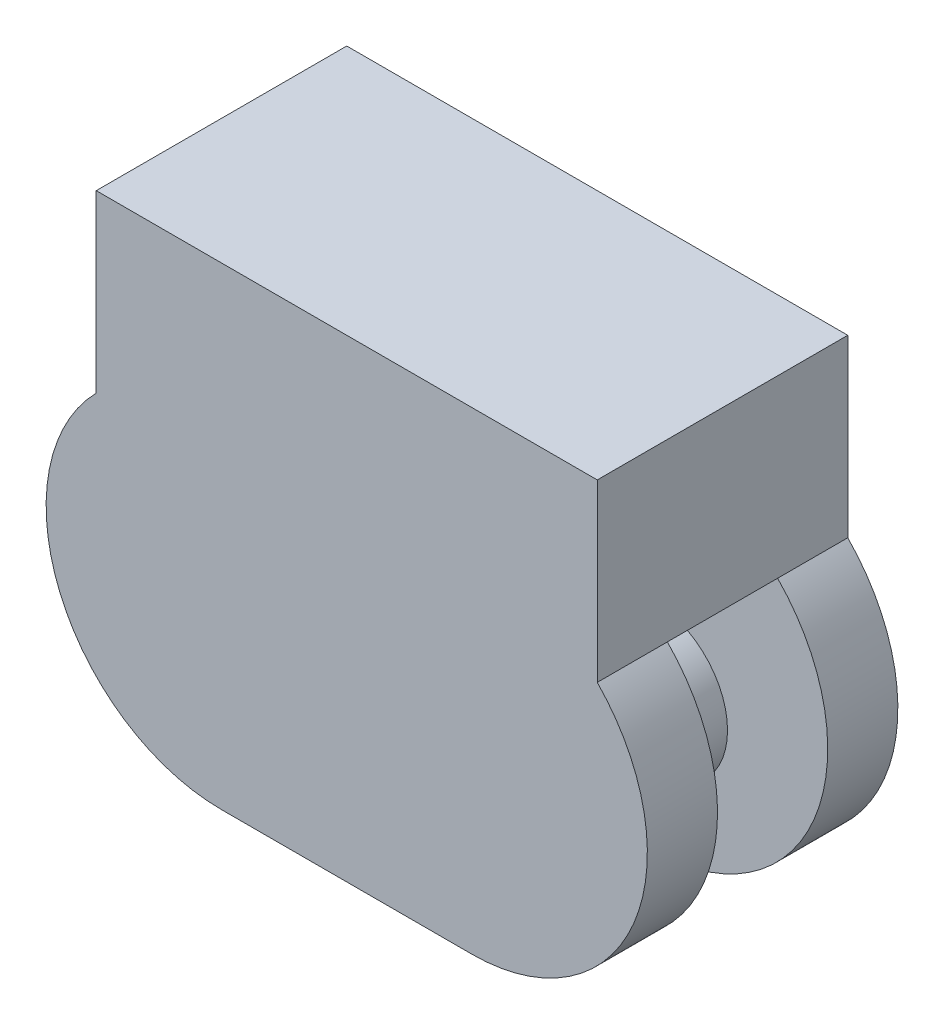
ISO-10303-21;
HEADER;
FILE_DESCRIPTION(('STEP AP214'),'2;1');
FILE_NAME('part.step','',(''),(''),'','','');
FILE_SCHEMA(('AUTOMOTIVE_DESIGN { 1 0 10303 214 1 1 1 1 }'));
ENDSEC;
DATA;
#1=APPLICATION_CONTEXT('core data for automotive mechanical design processes');
#2=APPLICATION_PROTOCOL_DEFINITION('international standard','automotive_design',2000,#1);
#3=PRODUCT_CONTEXT('',#1,'mechanical');
#4=PRODUCT('Part','Part','',(#3));
#5=PRODUCT_RELATED_PRODUCT_CATEGORY('part','',(#4));
#6=PRODUCT_DEFINITION_FORMATION('','',#4);
#7=PRODUCT_DEFINITION_CONTEXT('part definition',#1,'design');
#8=PRODUCT_DEFINITION('design','',#6,#7);
#9=PRODUCT_DEFINITION_SHAPE('','',#8);
#10=(LENGTH_UNIT() NAMED_UNIT(*) SI_UNIT(.MILLI.,.METRE.));
#11=(NAMED_UNIT(*) PLANE_ANGLE_UNIT() SI_UNIT($,.RADIAN.));
#12=(NAMED_UNIT(*) SI_UNIT($,.STERADIAN.) SOLID_ANGLE_UNIT());
#13=UNCERTAINTY_MEASURE_WITH_UNIT(LENGTH_MEASURE(1.E-05),#10,'distance_accuracy_value','');
#14=(GEOMETRIC_REPRESENTATION_CONTEXT(3) GLOBAL_UNCERTAINTY_ASSIGNED_CONTEXT((#13)) GLOBAL_UNIT_ASSIGNED_CONTEXT((#10,
#11,#12)) REPRESENTATION_CONTEXT('',''));
#15=CARTESIAN_POINT('',(0.,0.,0.));
#16=DIRECTION('',(0.,0.,1.));
#17=DIRECTION('',(1.,0.,0.));
#18=AXIS2_PLACEMENT_3D('',#15,#16,#17);
#19=CARTESIAN_POINT('',(-8.5,2.44948974278318,1.4));
#20=DIRECTION('',(0.,0.,-1.));
#21=DIRECTION('',(0.,1.,0.));
#22=AXIS2_PLACEMENT_3D('',#19,#20,#21);
#23=PLANE('',#22);
#24=DIRECTION('',(1.,0.,0.));
#25=VECTOR('',#24,1.);
#26=CARTESIAN_POINT('',(-8.5,2.44948974278318,1.4));
#27=LINE('',#26,#25);
#28=CARTESIAN_POINT('',(-7.5,2.44948974278318,1.4));
#29=VERTEX_POINT('',#28);
#30=CARTESIAN_POINT('',(2.5,2.44948974278318,1.4));
#31=VERTEX_POINT('',#30);
#32=EDGE_CURVE('E165',#29,#31,#27,.T.);
#33=ORIENTED_EDGE('',*,*,#32,.F.);
#34=CARTESIAN_POINT('',(-5.,0.,1.4));
#35=DIRECTION('',(0.,0.,-1.));
#36=DIRECTION('',(0.,1.,0.));
#37=AXIS2_PLACEMENT_3D('',#34,#35,#36);
#38=CIRCLE('',#37,3.5);
#39=CARTESIAN_POINT('',(-5.,-3.5,1.4));
#40=VERTEX_POINT('',#39);
#41=EDGE_CURVE('E174',#40,#29,#38,.T.);
#42=ORIENTED_EDGE('',*,*,#41,.F.);
#43=DIRECTION('',(-1.,0.,0.));
#44=VECTOR('',#43,1.);
#45=CARTESIAN_POINT('',(-5.,-3.5,1.4));
#46=LINE('',#45,#44);
#47=CARTESIAN_POINT('',(0.,-3.5,1.4));
#48=VERTEX_POINT('',#47);
#49=EDGE_CURVE('E236',#48,#40,#46,.T.);
#50=ORIENTED_EDGE('',*,*,#49,.F.);
#51=CARTESIAN_POINT('',(0.,0.,1.4));
#52=DIRECTION('',(0.,0.,-1.));
#53=DIRECTION('',(0.,1.,0.));
#54=AXIS2_PLACEMENT_3D('',#51,#52,#53);
#55=CIRCLE('',#54,3.5);
#56=EDGE_CURVE('E176',#31,#48,#55,.T.);
#57=ORIENTED_EDGE('',*,*,#56,.F.);
#58=EDGE_LOOP('',(#33,#42,#50,#57));
#59=FACE_BOUND('',#58,.T.);
#60=CARTESIAN_POINT('',(0.,-0.679025151906797,1.4));
#61=DIRECTION('',(0.,0.,-1.));
#62=DIRECTION('',(0.,1.,0.));
#63=AXIS2_PLACEMENT_3D('',#60,#61,#62);
#64=CIRCLE('',#63,1.5);
#65=CARTESIAN_POINT('',(0.,-2.1790251519068,1.4));
#66=VERTEX_POINT('',#65);
#67=CARTESIAN_POINT('',(0.,0.820974848093203,1.4));
#68=VERTEX_POINT('',#67);
#69=EDGE_CURVE('E136',#66,#68,#64,.F.);
#70=ORIENTED_EDGE('',*,*,#69,.F.);
#71=DIRECTION('',(1.,0.,0.));
#72=VECTOR('',#71,1.);
#73=CARTESIAN_POINT('',(-8.5,-2.1790251519068,1.4));
#74=LINE('',#73,#72);
#75=CARTESIAN_POINT('',(-5.,-2.1790251519068,1.4));
#76=VERTEX_POINT('',#75);
#77=EDGE_CURVE('E138',#76,#66,#74,.T.);
#78=ORIENTED_EDGE('',*,*,#77,.F.);
#79=CARTESIAN_POINT('',(-5.,-0.679025151906797,1.4));
#80=DIRECTION('',(0.,0.,-1.));
#81=DIRECTION('',(0.,1.,0.));
#82=AXIS2_PLACEMENT_3D('',#79,#80,#81);
#83=CIRCLE('',#82,1.5);
#84=CARTESIAN_POINT('',(-5.,0.820974848093203,1.4));
#85=VERTEX_POINT('',#84);
#86=EDGE_CURVE('E60',#85,#76,#83,.F.);
#87=ORIENTED_EDGE('',*,*,#86,.F.);
#88=DIRECTION('',(-1.,0.,0.));
#89=VECTOR('',#88,1.);
#90=CARTESIAN_POINT('',(-8.5,0.820974848093203,1.4));
#91=LINE('',#90,#89);
#92=EDGE_CURVE('E55',#68,#85,#91,.T.);
#93=ORIENTED_EDGE('',*,*,#92,.F.);
#94=EDGE_LOOP('',(#70,#78,#87,#93));
#95=FACE_BOUND('',#94,.T.);
#96=ADVANCED_FACE('F40',(#59,#95),#23,.F.);
#97=CARTESIAN_POINT('',(-8.5,2.44948974278318,3.6));
#98=DIRECTION('',(0.,0.,1.));
#99=DIRECTION('',(0.,-1.,0.));
#100=AXIS2_PLACEMENT_3D('',#97,#98,#99);
#101=PLANE('',#100);
#102=DIRECTION('',(1.,0.,0.));
#103=VECTOR('',#102,1.);
#104=CARTESIAN_POINT('',(-5.,-3.5,3.6));
#105=LINE('',#104,#103);
#106=CARTESIAN_POINT('',(-5.,-3.5,3.6));
#107=VERTEX_POINT('',#106);
#108=CARTESIAN_POINT('',(0.,-3.5,3.6));
#109=VERTEX_POINT('',#108);
#110=EDGE_CURVE('E233',#107,#109,#105,.T.);
#111=ORIENTED_EDGE('',*,*,#110,.F.);
#112=CARTESIAN_POINT('',(-5.,0.,3.6));
#113=DIRECTION('',(0.,0.,1.));
#114=DIRECTION('',(0.,-1.,0.));
#115=AXIS2_PLACEMENT_3D('',#112,#113,#114);
#116=CIRCLE('',#115,3.5);
#117=CARTESIAN_POINT('',(-7.5,2.44948974278318,3.6));
#118=VERTEX_POINT('',#117);
#119=EDGE_CURVE('E168',#118,#107,#116,.T.);
#120=ORIENTED_EDGE('',*,*,#119,.F.);
#121=DIRECTION('',(1.,0.,0.));
#122=VECTOR('',#121,1.);
#123=CARTESIAN_POINT('',(-8.5,2.44948974278318,3.6));
#124=LINE('',#123,#122);
#125=CARTESIAN_POINT('',(2.5,2.44948974278318,3.6));
#126=VERTEX_POINT('',#125);
#127=EDGE_CURVE('E143',#118,#126,#124,.T.);
#128=ORIENTED_EDGE('',*,*,#127,.T.);
#129=CARTESIAN_POINT('',(0.,0.,3.6));
#130=DIRECTION('',(0.,0.,1.));
#131=DIRECTION('',(0.,-1.,0.));
#132=AXIS2_PLACEMENT_3D('',#129,#130,#131);
#133=CIRCLE('',#132,3.5);
#134=EDGE_CURVE('E172',#109,#126,#133,.T.);
#135=ORIENTED_EDGE('',*,*,#134,.F.);
#136=EDGE_LOOP('',(#111,#120,#128,#135));
#137=FACE_BOUND('',#136,.T.);
#138=CARTESIAN_POINT('',(0.,-0.679025151906797,3.6));
#139=DIRECTION('',(0.,0.,1.));
#140=DIRECTION('',(0.,-1.,0.));
#141=AXIS2_PLACEMENT_3D('',#138,#139,#140);
#142=CIRCLE('',#141,1.5);
#143=CARTESIAN_POINT('',(0.,0.820974848093203,3.6));
#144=VERTEX_POINT('',#143);
#145=CARTESIAN_POINT('',(0.,-2.1790251519068,3.6));
#146=VERTEX_POINT('',#145);
#147=EDGE_CURVE('E11',#144,#146,#142,.F.);
#148=ORIENTED_EDGE('',*,*,#147,.F.);
#149=DIRECTION('',(1.,0.,0.));
#150=VECTOR('',#149,1.);
#151=CARTESIAN_POINT('',(-8.5,0.820974848093203,3.6));
#152=LINE('',#151,#150);
#153=CARTESIAN_POINT('',(-5.,0.820974848093203,3.6));
#154=VERTEX_POINT('',#153);
#155=EDGE_CURVE('E48',#154,#144,#152,.T.);
#156=ORIENTED_EDGE('',*,*,#155,.F.);
#157=CARTESIAN_POINT('',(-5.,-0.679025151906797,3.6));
#158=DIRECTION('',(0.,0.,1.));
#159=DIRECTION('',(0.,-1.,0.));
#160=AXIS2_PLACEMENT_3D('',#157,#158,#159);
#161=CIRCLE('',#160,1.5);
#162=CARTESIAN_POINT('',(-5.,-2.1790251519068,3.6));
#163=VERTEX_POINT('',#162);
#164=EDGE_CURVE('E241',#163,#154,#161,.F.);
#165=ORIENTED_EDGE('',*,*,#164,.F.);
#166=DIRECTION('',(-1.,0.,0.));
#167=VECTOR('',#166,1.);
#168=CARTESIAN_POINT('',(-8.5,-2.1790251519068,3.6));
#169=LINE('',#168,#167);
#170=EDGE_CURVE('E239',#146,#163,#169,.T.);
#171=ORIENTED_EDGE('',*,*,#170,.F.);
#172=EDGE_LOOP('',(#148,#156,#165,#171));
#173=FACE_BOUND('',#172,.T.);
#174=ADVANCED_FACE('F248',(#137,#173),#101,.F.);
#175=CARTESIAN_POINT('',(0.,0.,5.));
#176=DIRECTION('',(0.,0.,-1.));
#177=DIRECTION('',(-1.,0.,0.));
#178=AXIS2_PLACEMENT_3D('',#175,#176,#177);
#179=CYLINDRICAL_SURFACE('',#178,3.5);
#180=DIRECTION('',(0.,0.,-1.));
#181=VECTOR('',#180,1.);
#182=CARTESIAN_POINT('',(0.,-3.5,5.));
#183=LINE('',#182,#181);
#184=CARTESIAN_POINT('',(0.,-3.5,5.));
#185=VERTEX_POINT('',#184);
#186=EDGE_CURVE('E211',#185,#109,#183,.T.);
#187=ORIENTED_EDGE('',*,*,#186,.T.);
#188=ORIENTED_EDGE('',*,*,#134,.T.);
#189=DIRECTION('',(0.,0.,-1.));
#190=VECTOR('',#189,1.);
#191=CARTESIAN_POINT('',(2.5,2.44948974278318,5.));
#192=LINE('',#191,#190);
#193=CARTESIAN_POINT('',(2.5,2.44948974278318,5.));
#194=VERTEX_POINT('',#193);
#195=EDGE_CURVE('E230',#194,#126,#192,.T.);
#196=ORIENTED_EDGE('',*,*,#195,.F.);
#197=CARTESIAN_POINT('',(0.,0.,5.));
#198=DIRECTION('',(0.,0.,1.));
#199=DIRECTION('',(-1.,0.,0.));
#200=AXIS2_PLACEMENT_3D('',#197,#198,#199);
#201=CIRCLE('',#200,3.5);
#202=EDGE_CURVE('E182',#185,#194,#201,.T.);
#203=ORIENTED_EDGE('',*,*,#202,.F.);
#204=EDGE_LOOP('',(#187,#188,#196,#203));
#205=FACE_BOUND('',#204,.T.);
#206=ADVANCED_FACE('F265',(#205),#179,.T.);
#207=CARTESIAN_POINT('',(-5.,0.,5.));
#208=DIRECTION('',(0.,0.,-1.));
#209=DIRECTION('',(-1.,0.,0.));
#210=AXIS2_PLACEMENT_3D('',#207,#208,#209);
#211=CYLINDRICAL_SURFACE('',#210,3.5);
#212=DIRECTION('',(0.,0.,-1.));
#213=VECTOR('',#212,1.);
#214=CARTESIAN_POINT('',(-7.5,2.44948974278318,5.));
#215=LINE('',#214,#213);
#216=CARTESIAN_POINT('',(-7.5,2.44948974278318,5.));
#217=VERTEX_POINT('',#216);
#218=EDGE_CURVE('E219',#217,#118,#215,.T.);
#219=ORIENTED_EDGE('',*,*,#218,.T.);
#220=ORIENTED_EDGE('',*,*,#119,.T.);
#221=DIRECTION('',(0.,0.,-1.));
#222=VECTOR('',#221,1.);
#223=CARTESIAN_POINT('',(-5.,-3.5,5.));
#224=LINE('',#223,#222);
#225=CARTESIAN_POINT('',(-5.,-3.5,5.));
#226=VERTEX_POINT('',#225);
#227=EDGE_CURVE('E215',#226,#107,#224,.T.);
#228=ORIENTED_EDGE('',*,*,#227,.F.);
#229=CARTESIAN_POINT('',(-5.,0.,5.));
#230=DIRECTION('',(0.,0.,1.));
#231=DIRECTION('',(1.,0.,0.));
#232=AXIS2_PLACEMENT_3D('',#229,#230,#231);
#233=CIRCLE('',#232,3.5);
#234=EDGE_CURVE('E192',#217,#226,#233,.T.);
#235=ORIENTED_EDGE('',*,*,#234,.F.);
#236=EDGE_LOOP('',(#219,#220,#228,#235));
#237=FACE_BOUND('',#236,.T.);
#238=ADVANCED_FACE('F293',(#237),#211,.T.);
#239=CARTESIAN_POINT('',(-5.,-3.5,5.));
#240=DIRECTION('',(0.,1.,0.));
#241=DIRECTION('',(0.,0.,1.));
#242=AXIS2_PLACEMENT_3D('',#239,#240,#241);
#243=PLANE('',#242);
#244=CARTESIAN_POINT('',(0.,-3.5,0.));
#245=VERTEX_POINT('',#244);
#246=EDGE_CURVE('E196',#48,#245,#183,.T.);
#247=ORIENTED_EDGE('',*,*,#246,.F.);
#248=ORIENTED_EDGE('',*,*,#49,.T.);
#249=CARTESIAN_POINT('',(-5.,-3.5,0.));
#250=VERTEX_POINT('',#249);
#251=EDGE_CURVE('E214',#40,#250,#224,.T.);
#252=ORIENTED_EDGE('',*,*,#251,.T.);
#253=DIRECTION('',(1.,0.,0.));
#254=VECTOR('',#253,1.);
#255=CARTESIAN_POINT('',(-5.,-3.5,0.));
#256=LINE('',#255,#254);
#257=EDGE_CURVE('E186',#250,#245,#256,.T.);
#258=ORIENTED_EDGE('',*,*,#257,.T.);
#259=EDGE_LOOP('',(#247,#248,#252,#258));
#260=FACE_BOUND('',#259,.T.);
#261=ADVANCED_FACE('F288',(#260),#243,.F.);
#262=CARTESIAN_POINT('',(2.5,2.44948974278318,0.));
#263=VERTEX_POINT('',#262);
#264=EDGE_CURVE('E229',#31,#263,#192,.T.);
#265=ORIENTED_EDGE('',*,*,#264,.F.);
#266=ORIENTED_EDGE('',*,*,#56,.T.);
#267=ORIENTED_EDGE('',*,*,#246,.T.);
#268=CARTESIAN_POINT('',(0.,0.,0.));
#269=DIRECTION('',(0.,0.,1.));
#270=DIRECTION('',(-1.,0.,0.));
#271=AXIS2_PLACEMENT_3D('',#268,#269,#270);
#272=CIRCLE('',#271,3.5);
#273=EDGE_CURVE('E181',#245,#263,#272,.T.);
#274=ORIENTED_EDGE('',*,*,#273,.T.);
#275=EDGE_LOOP('',(#265,#266,#267,#274));
#276=FACE_BOUND('',#275,.T.);
#277=ADVANCED_FACE('F42',(#276),#179,.T.);
#278=CARTESIAN_POINT('',(2.5,5.94948974278318,5.));
#279=DIRECTION('',(-1.,0.,0.));
#280=DIRECTION('',(0.,-1.,0.));
#281=AXIS2_PLACEMENT_3D('',#278,#279,#280);
#282=PLANE('',#281);
#283=DIRECTION('',(0.,1.,0.));
#284=VECTOR('',#283,1.);
#285=CARTESIAN_POINT('',(2.5,5.94948974278318,0.));
#286=LINE('',#285,#284);
#287=CARTESIAN_POINT('',(2.5,5.94948974278318,0.));
#288=VERTEX_POINT('',#287);
#289=EDGE_CURVE('E199',#263,#288,#286,.T.);
#290=ORIENTED_EDGE('',*,*,#289,.T.);
#291=DIRECTION('',(0.,0.,-1.));
#292=VECTOR('',#291,1.);
#293=CARTESIAN_POINT('',(2.5,5.94948974278318,5.));
#294=LINE('',#293,#292);
#295=CARTESIAN_POINT('',(2.5,5.94948974278318,5.));
#296=VERTEX_POINT('',#295);
#297=EDGE_CURVE('E226',#296,#288,#294,.T.);
#298=ORIENTED_EDGE('',*,*,#297,.F.);
#299=DIRECTION('',(0.,1.,0.));
#300=VECTOR('',#299,1.);
#301=CARTESIAN_POINT('',(2.5,5.94948974278318,5.));
#302=LINE('',#301,#300);
#303=EDGE_CURVE('E185',#194,#296,#302,.T.);
#304=ORIENTED_EDGE('',*,*,#303,.F.);
#305=ORIENTED_EDGE('',*,*,#195,.T.);
#306=DIRECTION('',(0.,0.,-1.));
#307=VECTOR('',#306,1.);
#308=CARTESIAN_POINT('',(2.5,2.44948974278318,5.));
#309=LINE('',#308,#307);
#310=EDGE_CURVE('E178',#126,#31,#309,.T.);
#311=ORIENTED_EDGE('',*,*,#310,.T.);
#312=ORIENTED_EDGE('',*,*,#264,.T.);
#313=EDGE_LOOP('',(#290,#298,#304,#305,#311,#312));
#314=FACE_BOUND('',#313,.T.);
#315=ADVANCED_FACE('F299',(#314),#282,.F.);
#316=CARTESIAN_POINT('',(-7.5,5.94948974278318,5.));
#317=DIRECTION('',(0.,-1.,0.));
#318=DIRECTION('',(0.,0.,-1.));
#319=AXIS2_PLACEMENT_3D('',#316,#317,#318);
#320=PLANE('',#319);
#321=DIRECTION('',(-1.,0.,0.));
#322=VECTOR('',#321,1.);
#323=CARTESIAN_POINT('',(-7.5,5.94948974278318,0.));
#324=LINE('',#323,#322);
#325=CARTESIAN_POINT('',(-7.5,5.94948974278318,0.));
#326=VERTEX_POINT('',#325);
#327=EDGE_CURVE('E201',#288,#326,#324,.T.);
#328=ORIENTED_EDGE('',*,*,#327,.T.);
#329=DIRECTION('',(0.,0.,-1.));
#330=VECTOR('',#329,1.);
#331=CARTESIAN_POINT('',(-7.5,5.94948974278318,5.));
#332=LINE('',#331,#330);
#333=CARTESIAN_POINT('',(-7.5,5.94948974278318,5.));
#334=VERTEX_POINT('',#333);
#335=EDGE_CURVE('E222',#334,#326,#332,.T.);
#336=ORIENTED_EDGE('',*,*,#335,.F.);
#337=DIRECTION('',(-1.,0.,0.));
#338=VECTOR('',#337,1.);
#339=CARTESIAN_POINT('',(-7.5,5.94948974278318,5.));
#340=LINE('',#339,#338);
#341=EDGE_CURVE('E188',#296,#334,#340,.T.);
#342=ORIENTED_EDGE('',*,*,#341,.F.);
#343=ORIENTED_EDGE('',*,*,#297,.T.);
#344=EDGE_LOOP('',(#328,#336,#342,#343));
#345=FACE_BOUND('',#344,.T.);
#346=ADVANCED_FACE('F296',(#345),#320,.F.);
#347=CARTESIAN_POINT('',(-7.5,5.94948974278318,5.));
#348=DIRECTION('',(1.,0.,0.));
#349=DIRECTION('',(0.,1.,0.));
#350=AXIS2_PLACEMENT_3D('',#347,#348,#349);
#351=PLANE('',#350);
#352=DIRECTION('',(0.,-1.,0.));
#353=VECTOR('',#352,1.);
#354=CARTESIAN_POINT('',(-7.5,5.94948974278318,0.));
#355=LINE('',#354,#353);
#356=CARTESIAN_POINT('',(-7.5,2.44948974278318,0.));
#357=VERTEX_POINT('',#356);
#358=EDGE_CURVE('E203',#326,#357,#355,.T.);
#359=ORIENTED_EDGE('',*,*,#358,.T.);
#360=EDGE_CURVE('E218',#29,#357,#215,.T.);
#361=ORIENTED_EDGE('',*,*,#360,.F.);
#362=EDGE_CURVE('E223',#118,#29,#215,.T.);
#363=ORIENTED_EDGE('',*,*,#362,.F.);
#364=ORIENTED_EDGE('',*,*,#218,.F.);
#365=DIRECTION('',(0.,-1.,0.));
#366=VECTOR('',#365,1.);
#367=CARTESIAN_POINT('',(-7.5,5.94948974278318,5.));
#368=LINE('',#367,#366);
#369=EDGE_CURVE('E190',#334,#217,#368,.T.);
#370=ORIENTED_EDGE('',*,*,#369,.F.);
#371=ORIENTED_EDGE('',*,*,#335,.T.);
#372=EDGE_LOOP('',(#359,#361,#363,#364,#370,#371));
#373=FACE_BOUND('',#372,.T.);
#374=ADVANCED_FACE('F291',(#373),#351,.F.);
#375=ORIENTED_EDGE('',*,*,#251,.F.);
#376=ORIENTED_EDGE('',*,*,#41,.T.);
#377=ORIENTED_EDGE('',*,*,#360,.T.);
#378=CARTESIAN_POINT('',(-5.,0.,0.));
#379=DIRECTION('',(0.,0.,1.));
#380=DIRECTION('',(1.,0.,0.));
#381=AXIS2_PLACEMENT_3D('',#378,#379,#380);
#382=CIRCLE('',#381,3.5);
#383=EDGE_CURVE('E206',#357,#250,#382,.T.);
#384=ORIENTED_EDGE('',*,*,#383,.T.);
#385=EDGE_LOOP('',(#375,#376,#377,#384));
#386=FACE_BOUND('',#385,.T.);
#387=ADVANCED_FACE('F286',(#386),#211,.T.);
#388=ORIENTED_EDGE('',*,*,#227,.T.);
#389=ORIENTED_EDGE('',*,*,#110,.T.);
#390=ORIENTED_EDGE('',*,*,#186,.F.);
#391=DIRECTION('',(1.,0.,0.));
#392=VECTOR('',#391,1.);
#393=CARTESIAN_POINT('',(-5.,-3.5,5.));
#394=LINE('',#393,#392);
#395=EDGE_CURVE('E194',#226,#185,#394,.T.);
#396=ORIENTED_EDGE('',*,*,#395,.F.);
#397=EDGE_LOOP('',(#388,#389,#390,#396));
#398=FACE_BOUND('',#397,.T.);
#399=ADVANCED_FACE('F279',(#398),#243,.F.);
#400=CARTESIAN_POINT('',(0.,0.,5.));
#401=DIRECTION('',(0.,0.,-1.));
#402=DIRECTION('',(-1.,0.,0.));
#403=AXIS2_PLACEMENT_3D('',#400,#401,#402);
#404=PLANE('',#403);
#405=ORIENTED_EDGE('',*,*,#202,.T.);
#406=ORIENTED_EDGE('',*,*,#303,.T.);
#407=ORIENTED_EDGE('',*,*,#341,.T.);
#408=ORIENTED_EDGE('',*,*,#369,.T.);
#409=ORIENTED_EDGE('',*,*,#234,.T.);
#410=ORIENTED_EDGE('',*,*,#395,.T.);
#411=EDGE_LOOP('',(#405,#406,#407,#408,#409,#410));
#412=FACE_BOUND('',#411,.T.);
#413=ADVANCED_FACE('F276',(#412),#404,.F.);
#414=CARTESIAN_POINT('',(0.,0.,0.));
#415=DIRECTION('',(0.,0.,-1.));
#416=DIRECTION('',(-1.,0.,0.));
#417=AXIS2_PLACEMENT_3D('',#414,#415,#416);
#418=PLANE('',#417);
#419=ORIENTED_EDGE('',*,*,#273,.F.);
#420=ORIENTED_EDGE('',*,*,#257,.F.);
#421=ORIENTED_EDGE('',*,*,#383,.F.);
#422=ORIENTED_EDGE('',*,*,#358,.F.);
#423=ORIENTED_EDGE('',*,*,#327,.F.);
#424=ORIENTED_EDGE('',*,*,#289,.F.);
#425=EDGE_LOOP('',(#419,#420,#421,#422,#423,#424));
#426=FACE_BOUND('',#425,.T.);
#427=ADVANCED_FACE('F274',(#426),#418,.T.);
#428=CARTESIAN_POINT('',(-8.5,2.44948974278318,1.4));
#429=DIRECTION('',(0.,1.,0.));
#430=DIRECTION('',(0.,0.,1.));
#431=AXIS2_PLACEMENT_3D('',#428,#429,#430);
#432=PLANE('',#431);
#433=ORIENTED_EDGE('',*,*,#127,.F.);
#434=ORIENTED_EDGE('',*,*,#362,.T.);
#435=ORIENTED_EDGE('',*,*,#32,.T.);
#436=ORIENTED_EDGE('',*,*,#310,.F.);
#437=EDGE_LOOP('',(#433,#434,#435,#436));
#438=FACE_BOUND('',#437,.T.);
#439=ADVANCED_FACE('F271',(#438),#432,.F.);
#440=CARTESIAN_POINT('',(0.,-0.679025151906797,5.));
#441=DIRECTION('',(0.,0.,-1.));
#442=DIRECTION('',(-1.,0.,0.));
#443=AXIS2_PLACEMENT_3D('',#440,#441,#442);
#444=CYLINDRICAL_SURFACE('',#443,1.5);
#445=DIRECTION('',(0.,0.,-1.));
#446=VECTOR('',#445,1.);
#447=CARTESIAN_POINT('',(0.,-2.1790251519068,5.));
#448=LINE('',#447,#446);
#449=EDGE_CURVE('E150',#146,#66,#448,.T.);
#450=ORIENTED_EDGE('',*,*,#449,.T.);
#451=ORIENTED_EDGE('',*,*,#69,.T.);
#452=DIRECTION('',(0.,0.,-1.));
#453=VECTOR('',#452,1.);
#454=CARTESIAN_POINT('',(0.,0.820974848093203,5.));
#455=LINE('',#454,#453);
#456=EDGE_CURVE('E153',#144,#68,#455,.T.);
#457=ORIENTED_EDGE('',*,*,#456,.F.);
#458=ORIENTED_EDGE('',*,*,#147,.T.);
#459=EDGE_LOOP('',(#450,#451,#457,#458));
#460=FACE_BOUND('',#459,.T.);
#461=ADVANCED_FACE('F155',(#460),#444,.T.);
#462=CARTESIAN_POINT('',(0.,0.820974848093203,5.));
#463=DIRECTION('',(0.,-1.,0.));
#464=DIRECTION('',(0.,0.,-1.));
#465=AXIS2_PLACEMENT_3D('',#462,#463,#464);
#466=PLANE('',#465);
#467=ORIENTED_EDGE('',*,*,#456,.T.);
#468=ORIENTED_EDGE('',*,*,#92,.T.);
#469=DIRECTION('',(0.,0.,-1.));
#470=VECTOR('',#469,1.);
#471=CARTESIAN_POINT('',(-5.,0.820974848093203,5.));
#472=LINE('',#471,#470);
#473=EDGE_CURVE('E157',#154,#85,#472,.T.);
#474=ORIENTED_EDGE('',*,*,#473,.F.);
#475=ORIENTED_EDGE('',*,*,#155,.T.);
#476=EDGE_LOOP('',(#467,#468,#474,#475));
#477=FACE_BOUND('',#476,.T.);
#478=ADVANCED_FACE('F246',(#477),#466,.F.);
#479=CARTESIAN_POINT('',(-5.,-0.679025151906797,5.));
#480=DIRECTION('',(0.,0.,-1.));
#481=DIRECTION('',(-1.,0.,0.));
#482=AXIS2_PLACEMENT_3D('',#479,#480,#481);
#483=CYLINDRICAL_SURFACE('',#482,1.5);
#484=ORIENTED_EDGE('',*,*,#473,.T.);
#485=ORIENTED_EDGE('',*,*,#86,.T.);
#486=DIRECTION('',(0.,0.,-1.));
#487=VECTOR('',#486,1.);
#488=CARTESIAN_POINT('',(-5.,-2.1790251519068,5.));
#489=LINE('',#488,#487);
#490=EDGE_CURVE('E152',#163,#76,#489,.T.);
#491=ORIENTED_EDGE('',*,*,#490,.F.);
#492=ORIENTED_EDGE('',*,*,#164,.T.);
#493=EDGE_LOOP('',(#484,#485,#491,#492));
#494=FACE_BOUND('',#493,.T.);
#495=ADVANCED_FACE('F250',(#494),#483,.T.);
#496=CARTESIAN_POINT('',(-5.,-2.1790251519068,5.));
#497=DIRECTION('',(0.,1.,0.));
#498=DIRECTION('',(0.,0.,1.));
#499=AXIS2_PLACEMENT_3D('',#496,#497,#498);
#500=PLANE('',#499);
#501=ORIENTED_EDGE('',*,*,#490,.T.);
#502=ORIENTED_EDGE('',*,*,#77,.T.);
#503=ORIENTED_EDGE('',*,*,#449,.F.);
#504=ORIENTED_EDGE('',*,*,#170,.T.);
#505=EDGE_LOOP('',(#501,#502,#503,#504));
#506=FACE_BOUND('',#505,.T.);
#507=ADVANCED_FACE('F148',(#506),#500,.F.);
#508=CLOSED_SHELL('',(#96,#174,#206,#238,#261,#277,#315,#346,#374,#387,#399,#413,#427,#439,#461,
#478,#495,#507));
#509=MANIFOLD_SOLID_BREP('B2',#508);
#510=ADVANCED_BREP_SHAPE_REPRESENTATION('',(#18,#509),#14);
#511=SHAPE_DEFINITION_REPRESENTATION(#9,#510);
ENDSEC;
END-ISO-10303-21;
